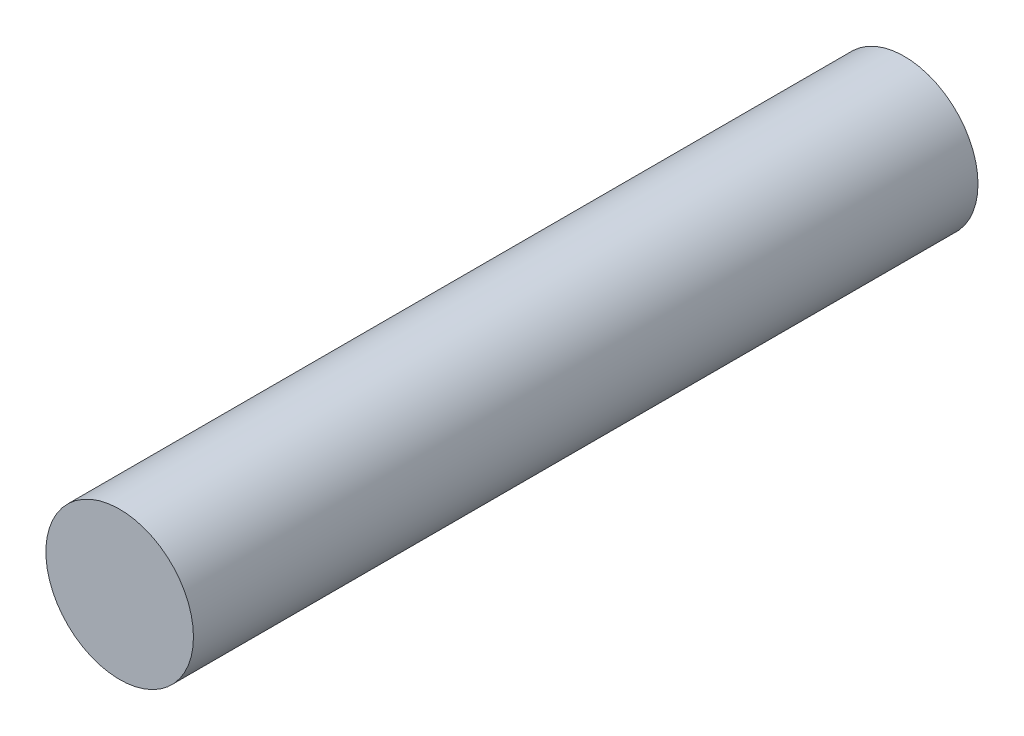
ISO-10303-21;
HEADER;
FILE_DESCRIPTION(('STEP AP214'),'2;1');
FILE_NAME('part.step','',(''),(''),'','','');
FILE_SCHEMA(('AUTOMOTIVE_DESIGN { 1 0 10303 214 1 1 1 1 }'));
ENDSEC;
DATA;
#1=APPLICATION_CONTEXT('core data for automotive mechanical design processes');
#2=APPLICATION_PROTOCOL_DEFINITION('international standard','automotive_design',2000,#1);
#3=PRODUCT_CONTEXT('',#1,'mechanical');
#4=PRODUCT('Part','Part','',(#3));
#5=PRODUCT_RELATED_PRODUCT_CATEGORY('part','',(#4));
#6=PRODUCT_DEFINITION_FORMATION('','',#4);
#7=PRODUCT_DEFINITION_CONTEXT('part definition',#1,'design');
#8=PRODUCT_DEFINITION('design','',#6,#7);
#9=PRODUCT_DEFINITION_SHAPE('','',#8);
#10=(LENGTH_UNIT() NAMED_UNIT(*) SI_UNIT(.MILLI.,.METRE.));
#11=(NAMED_UNIT(*) PLANE_ANGLE_UNIT() SI_UNIT($,.RADIAN.));
#12=(NAMED_UNIT(*) SI_UNIT($,.STERADIAN.) SOLID_ANGLE_UNIT());
#13=UNCERTAINTY_MEASURE_WITH_UNIT(LENGTH_MEASURE(1.E-05),#10,'distance_accuracy_value','');
#14=(GEOMETRIC_REPRESENTATION_CONTEXT(3) GLOBAL_UNCERTAINTY_ASSIGNED_CONTEXT((#13)) GLOBAL_UNIT_ASSIGNED_CONTEXT((#10,
#11,#12)) REPRESENTATION_CONTEXT('',''));
#15=CARTESIAN_POINT('',(0.,0.,0.));
#16=DIRECTION('',(0.,0.,1.));
#17=DIRECTION('',(1.,0.,0.));
#18=AXIS2_PLACEMENT_3D('',#15,#16,#17);
#19=CARTESIAN_POINT('',(0.,0.,16.));
#20=DIRECTION('',(0.,0.,-1.));
#21=DIRECTION('',(-1.,0.,0.));
#22=AXIS2_PLACEMENT_3D('',#19,#20,#21);
#23=CYLINDRICAL_SURFACE('',#22,1.505);
#24=CARTESIAN_POINT('',(0.,0.,16.));
#25=DIRECTION('',(0.,0.,1.));
#26=DIRECTION('',(1.,0.,0.));
#27=AXIS2_PLACEMENT_3D('',#24,#25,#26);
#28=CIRCLE('',#27,1.505);
#29=CARTESIAN_POINT('',(1.505,0.,16.));
#30=VERTEX_POINT('',#29);
#31=EDGE_CURVE('E10',#30,#30,#28,.T.);
#32=ORIENTED_EDGE('',*,*,#31,.F.);
#33=EDGE_LOOP('',(#32));
#34=FACE_BOUND('',#33,.T.);
#35=CARTESIAN_POINT('',(0.,0.,0.));
#36=DIRECTION('',(0.,0.,1.));
#37=DIRECTION('',(1.,0.,0.));
#38=AXIS2_PLACEMENT_3D('',#35,#36,#37);
#39=CIRCLE('',#38,1.505);
#40=CARTESIAN_POINT('',(1.505,0.,0.));
#41=VERTEX_POINT('',#40);
#42=EDGE_CURVE('E40',#41,#41,#39,.T.);
#43=ORIENTED_EDGE('',*,*,#42,.T.);
#44=EDGE_LOOP('',(#43));
#45=FACE_BOUND('',#44,.T.);
#46=ADVANCED_FACE('F37',(#34,#45),#23,.T.);
#47=CARTESIAN_POINT('',(0.,0.,16.));
#48=DIRECTION('',(0.,0.,1.));
#49=DIRECTION('',(1.,0.,0.));
#50=AXIS2_PLACEMENT_3D('',#47,#48,#49);
#51=PLANE('',#50);
#52=ORIENTED_EDGE('',*,*,#31,.T.);
#53=EDGE_LOOP('',(#52));
#54=FACE_BOUND('',#53,.T.);
#55=ADVANCED_FACE('F54',(#54),#51,.T.);
#56=CARTESIAN_POINT('',(0.,0.,0.));
#57=DIRECTION('',(0.,0.,1.));
#58=DIRECTION('',(1.,0.,0.));
#59=AXIS2_PLACEMENT_3D('',#56,#57,#58);
#60=PLANE('',#59);
#61=ORIENTED_EDGE('',*,*,#42,.F.);
#62=EDGE_LOOP('',(#61));
#63=FACE_BOUND('',#62,.T.);
#64=ADVANCED_FACE('F52',(#63),#60,.F.);
#65=CLOSED_SHELL('',(#46,#55,#64));
#66=MANIFOLD_SOLID_BREP('B2',#65);
#67=ADVANCED_BREP_SHAPE_REPRESENTATION('',(#18,#66),#14);
#68=SHAPE_DEFINITION_REPRESENTATION(#9,#67);
ENDSEC;
END-ISO-10303-21;
